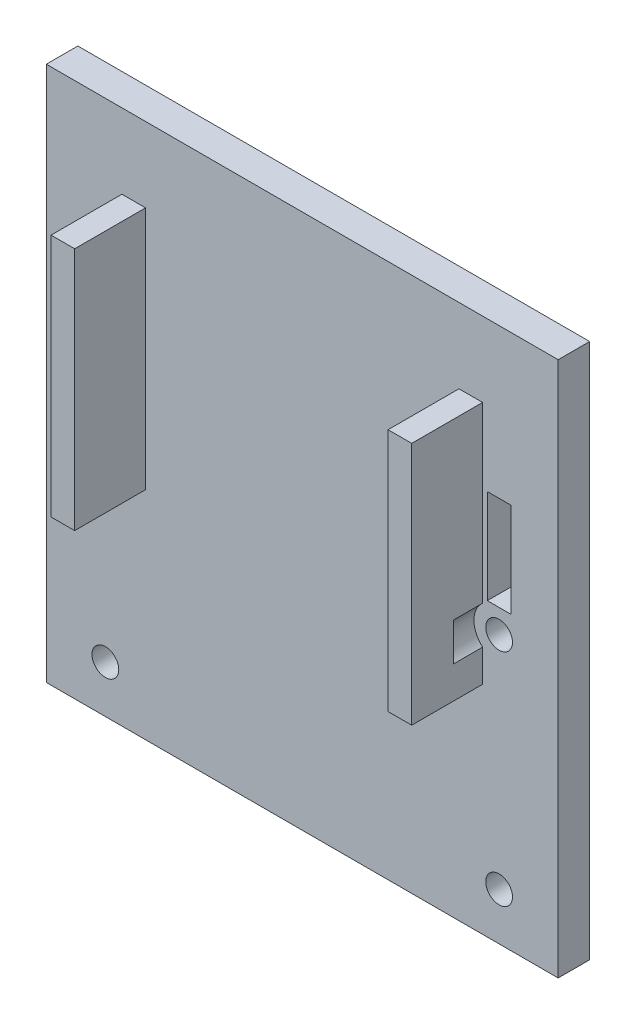
ISO-10303-21;
HEADER;
FILE_DESCRIPTION(('STEP AP214'),'2;1');
FILE_NAME('part.step','',(''),(''),'','','');
FILE_SCHEMA(('AUTOMOTIVE_DESIGN { 1 0 10303 214 1 1 1 1 }'));
ENDSEC;
DATA;
#1=APPLICATION_CONTEXT('core data for automotive mechanical design processes');
#2=APPLICATION_PROTOCOL_DEFINITION('international standard','automotive_design',2000,#1);
#3=PRODUCT_CONTEXT('',#1,'mechanical');
#4=PRODUCT('Part','Part','',(#3));
#5=PRODUCT_RELATED_PRODUCT_CATEGORY('part','',(#4));
#6=PRODUCT_DEFINITION_FORMATION('','',#4);
#7=PRODUCT_DEFINITION_CONTEXT('part definition',#1,'design');
#8=PRODUCT_DEFINITION('design','',#6,#7);
#9=PRODUCT_DEFINITION_SHAPE('','',#8);
#10=(LENGTH_UNIT() NAMED_UNIT(*) SI_UNIT(.MILLI.,.METRE.));
#11=(NAMED_UNIT(*) PLANE_ANGLE_UNIT() SI_UNIT($,.RADIAN.));
#12=(NAMED_UNIT(*) SI_UNIT($,.STERADIAN.) SOLID_ANGLE_UNIT());
#13=UNCERTAINTY_MEASURE_WITH_UNIT(LENGTH_MEASURE(1.E-05),#10,'distance_accuracy_value','');
#14=(GEOMETRIC_REPRESENTATION_CONTEXT(3) GLOBAL_UNCERTAINTY_ASSIGNED_CONTEXT((#13)) GLOBAL_UNIT_ASSIGNED_CONTEXT((#10,
#11,#12)) REPRESENTATION_CONTEXT('',''));
#15=CARTESIAN_POINT('',(0.,0.,0.));
#16=DIRECTION('',(0.,0.,1.));
#17=DIRECTION('',(1.,0.,0.));
#18=AXIS2_PLACEMENT_3D('',#15,#16,#17);
#19=CARTESIAN_POINT('',(0.,0.,4.));
#20=DIRECTION('',(0.,0.,1.));
#21=DIRECTION('',(1.,0.,0.));
#22=AXIS2_PLACEMENT_3D('',#19,#20,#21);
#23=PLANE('',#22);
#24=CARTESIAN_POINT('',(25.,-37.,4.));
#25=DIRECTION('',(0.,0.,1.));
#26=DIRECTION('',(1.,0.,0.));
#27=AXIS2_PLACEMENT_3D('',#24,#25,#26);
#28=CIRCLE('',#27,1.7);
#29=CARTESIAN_POINT('',(26.7,-37.,4.));
#30=VERTEX_POINT('',#29);
#31=EDGE_CURVE('E261',#30,#30,#28,.F.);
#32=ORIENTED_EDGE('',*,*,#31,.T.);
#33=EDGE_LOOP('',(#32));
#34=FACE_BOUND('',#33,.T.);
#35=CARTESIAN_POINT('',(-25.,-37.,4.));
#36=DIRECTION('',(0.,0.,1.));
#37=DIRECTION('',(1.,0.,0.));
#38=AXIS2_PLACEMENT_3D('',#35,#36,#37);
#39=CIRCLE('',#38,1.7);
#40=CARTESIAN_POINT('',(-23.3,-37.,4.));
#41=VERTEX_POINT('',#40);
#42=EDGE_CURVE('E253',#41,#41,#39,.F.);
#43=ORIENTED_EDGE('',*,*,#42,.T.);
#44=EDGE_LOOP('',(#43));
#45=FACE_BOUND('',#44,.T.);
#46=DIRECTION('',(1.,0.,0.));
#47=VECTOR('',#46,1.);
#48=CARTESIAN_POINT('',(-32.5,-43.,4.));
#49=LINE('',#48,#47);
#50=CARTESIAN_POINT('',(-32.5,-43.,4.));
#51=VERTEX_POINT('',#50);
#52=CARTESIAN_POINT('',(32.5,-43.,4.));
#53=VERTEX_POINT('',#52);
#54=EDGE_CURVE('E331',#51,#53,#49,.T.);
#55=ORIENTED_EDGE('',*,*,#54,.T.);
#56=DIRECTION('',(0.,1.,0.));
#57=VECTOR('',#56,1.);
#58=CARTESIAN_POINT('',(32.5,-43.,4.));
#59=LINE('',#58,#57);
#60=CARTESIAN_POINT('',(32.5,25.,4.));
#61=VERTEX_POINT('',#60);
#62=EDGE_CURVE('E334',#53,#61,#59,.T.);
#63=ORIENTED_EDGE('',*,*,#62,.T.);
#64=DIRECTION('',(-1.,0.,0.));
#65=VECTOR('',#64,1.);
#66=CARTESIAN_POINT('',(32.5,25.,4.));
#67=LINE('',#66,#65);
#68=CARTESIAN_POINT('',(-32.5,25.,4.));
#69=VERTEX_POINT('',#68);
#70=EDGE_CURVE('E337',#61,#69,#67,.T.);
#71=ORIENTED_EDGE('',*,*,#70,.T.);
#72=DIRECTION('',(0.,-1.,0.));
#73=VECTOR('',#72,1.);
#74=CARTESIAN_POINT('',(-32.5,25.,4.));
#75=LINE('',#74,#73);
#76=EDGE_CURVE('E339',#69,#51,#75,.T.);
#77=ORIENTED_EDGE('',*,*,#76,.T.);
#78=EDGE_LOOP('',(#55,#63,#71,#77));
#79=FACE_BOUND('',#78,.T.);
#80=DIRECTION('',(0.,-1.,0.));
#81=VECTOR('',#80,1.);
#82=CARTESIAN_POINT('',(-22.9,-15.5,4.));
#83=LINE('',#82,#81);
#84=CARTESIAN_POINT('',(-22.9,-11.4145392935299,4.));
#85=VERTEX_POINT('',#84);
#86=CARTESIAN_POINT('',(-22.9,-15.5,4.));
#87=VERTEX_POINT('',#86);
#88=EDGE_CURVE('E318',#85,#87,#83,.T.);
#89=ORIENTED_EDGE('',*,*,#88,.F.);
#90=CARTESIAN_POINT('',(-25.,-9.,4.));
#91=DIRECTION('',(0.,0.,1.));
#92=DIRECTION('',(1.,0.,0.));
#93=AXIS2_PLACEMENT_3D('',#90,#91,#92);
#94=CIRCLE('',#93,3.2);
#95=CARTESIAN_POINT('',(-22.9,-6.58546070647007,4.));
#96=VERTEX_POINT('',#95);
#97=EDGE_CURVE('E247',#85,#96,#94,.T.);
#98=ORIENTED_EDGE('',*,*,#97,.T.);
#99=CARTESIAN_POINT('',(-22.9,15.5,4.));
#100=VERTEX_POINT('',#99);
#101=EDGE_CURVE('E304',#100,#96,#83,.T.);
#102=ORIENTED_EDGE('',*,*,#101,.F.);
#103=DIRECTION('',(-1.,0.,0.));
#104=VECTOR('',#103,1.);
#105=CARTESIAN_POINT('',(-22.9,15.5,4.));
#106=LINE('',#105,#104);
#107=CARTESIAN_POINT('',(-19.9,15.5,4.));
#108=VERTEX_POINT('',#107);
#109=EDGE_CURVE('E315',#108,#100,#106,.T.);
#110=ORIENTED_EDGE('',*,*,#109,.F.);
#111=DIRECTION('',(0.,1.,0.));
#112=VECTOR('',#111,1.);
#113=CARTESIAN_POINT('',(-19.9,15.5,4.));
#114=LINE('',#113,#112);
#115=CARTESIAN_POINT('',(-19.9,-15.5,4.));
#116=VERTEX_POINT('',#115);
#117=EDGE_CURVE('E313',#116,#108,#114,.T.);
#118=ORIENTED_EDGE('',*,*,#117,.F.);
#119=DIRECTION('',(1.,0.,0.));
#120=VECTOR('',#119,1.);
#121=CARTESIAN_POINT('',(-19.9,-15.5,4.));
#122=LINE('',#121,#120);
#123=EDGE_CURVE('E292',#87,#116,#122,.T.);
#124=ORIENTED_EDGE('',*,*,#123,.F.);
#125=EDGE_LOOP('',(#89,#98,#102,#110,#118,#124));
#126=FACE_BOUND('',#125,.T.);
#127=DIRECTION('',(0.,1.,0.));
#128=VECTOR('',#127,1.);
#129=CARTESIAN_POINT('',(22.9,15.5,4.));
#130=LINE('',#129,#128);
#131=CARTESIAN_POINT('',(22.9,-6.58546070647007,4.));
#132=VERTEX_POINT('',#131);
#133=CARTESIAN_POINT('',(22.9,15.5,4.));
#134=VERTEX_POINT('',#133);
#135=EDGE_CURVE('E285',#132,#134,#130,.T.);
#136=ORIENTED_EDGE('',*,*,#135,.F.);
#137=CARTESIAN_POINT('',(25.,-9.,4.));
#138=DIRECTION('',(0.,0.,1.));
#139=DIRECTION('',(1.,0.,0.));
#140=AXIS2_PLACEMENT_3D('',#137,#138,#139);
#141=CIRCLE('',#140,3.2);
#142=CARTESIAN_POINT('',(22.9,-11.4145392935299,4.));
#143=VERTEX_POINT('',#142);
#144=EDGE_CURVE('E249',#132,#143,#141,.T.);
#145=ORIENTED_EDGE('',*,*,#144,.T.);
#146=CARTESIAN_POINT('',(22.9,-15.5,4.));
#147=VERTEX_POINT('',#146);
#148=EDGE_CURVE('E286',#147,#143,#130,.T.);
#149=ORIENTED_EDGE('',*,*,#148,.F.);
#150=DIRECTION('',(1.,0.,0.));
#151=VECTOR('',#150,1.);
#152=CARTESIAN_POINT('',(22.9,-15.5,4.));
#153=LINE('',#152,#151);
#154=CARTESIAN_POINT('',(19.9,-15.5,4.));
#155=VERTEX_POINT('',#154);
#156=EDGE_CURVE('E289',#155,#147,#153,.T.);
#157=ORIENTED_EDGE('',*,*,#156,.F.);
#158=DIRECTION('',(0.,-1.,0.));
#159=VECTOR('',#158,1.);
#160=CARTESIAN_POINT('',(19.9,-15.5,4.));
#161=LINE('',#160,#159);
#162=CARTESIAN_POINT('',(19.9,15.5,4.));
#163=VERTEX_POINT('',#162);
#164=EDGE_CURVE('E279',#163,#155,#161,.T.);
#165=ORIENTED_EDGE('',*,*,#164,.F.);
#166=DIRECTION('',(-1.,0.,0.));
#167=VECTOR('',#166,1.);
#168=CARTESIAN_POINT('',(19.9,15.5,4.));
#169=LINE('',#168,#167);
#170=EDGE_CURVE('E281',#134,#163,#169,.T.);
#171=ORIENTED_EDGE('',*,*,#170,.F.);
#172=EDGE_LOOP('',(#136,#145,#149,#157,#165,#171));
#173=FACE_BOUND('',#172,.T.);
#174=CARTESIAN_POINT('',(25.,-9.,4.));
#175=DIRECTION('',(0.,0.,1.));
#176=DIRECTION('',(1.,0.,0.));
#177=AXIS2_PLACEMENT_3D('',#174,#175,#176);
#178=CIRCLE('',#177,1.7);
#179=CARTESIAN_POINT('',(26.7,-9.,4.));
#180=VERTEX_POINT('',#179);
#181=EDGE_CURVE('E257',#180,#180,#178,.F.);
#182=ORIENTED_EDGE('',*,*,#181,.T.);
#183=EDGE_LOOP('',(#182));
#184=FACE_BOUND('',#183,.T.);
#185=CARTESIAN_POINT('',(-25.,-9.,4.));
#186=DIRECTION('',(0.,0.,1.));
#187=DIRECTION('',(1.,0.,0.));
#188=AXIS2_PLACEMENT_3D('',#185,#186,#187);
#189=CIRCLE('',#188,1.7);
#190=CARTESIAN_POINT('',(-23.3,-9.,4.));
#191=VERTEX_POINT('',#190);
#192=EDGE_CURVE('E265',#191,#191,#189,.F.);
#193=ORIENTED_EDGE('',*,*,#192,.T.);
#194=EDGE_LOOP('',(#193));
#195=FACE_BOUND('',#194,.T.);
#196=DIRECTION('',(0.,-1.,0.));
#197=VECTOR('',#196,1.);
#198=CARTESIAN_POINT('',(26.5,0.,4.));
#199=LINE('',#198,#197);
#200=CARTESIAN_POINT('',(26.5,6.,4.));
#201=VERTEX_POINT('',#200);
#202=CARTESIAN_POINT('',(26.5,-6.,4.));
#203=VERTEX_POINT('',#202);
#204=EDGE_CURVE('E225',#201,#203,#199,.T.);
#205=ORIENTED_EDGE('',*,*,#204,.T.);
#206=DIRECTION('',(-1.,0.,0.));
#207=VECTOR('',#206,1.);
#208=CARTESIAN_POINT('',(0.,-6.,4.));
#209=LINE('',#208,#207);
#210=CARTESIAN_POINT('',(23.5,-6.,4.));
#211=VERTEX_POINT('',#210);
#212=EDGE_CURVE('E216',#203,#211,#209,.T.);
#213=ORIENTED_EDGE('',*,*,#212,.T.);
#214=DIRECTION('',(0.,1.,0.));
#215=VECTOR('',#214,1.);
#216=CARTESIAN_POINT('',(23.5,0.,4.));
#217=LINE('',#216,#215);
#218=CARTESIAN_POINT('',(23.5,6.,4.));
#219=VERTEX_POINT('',#218);
#220=EDGE_CURVE('E202',#211,#219,#217,.T.);
#221=ORIENTED_EDGE('',*,*,#220,.T.);
#222=DIRECTION('',(1.,0.,0.));
#223=VECTOR('',#222,1.);
#224=CARTESIAN_POINT('',(0.,6.,4.));
#225=LINE('',#224,#223);
#226=EDGE_CURVE('E210',#219,#201,#225,.T.);
#227=ORIENTED_EDGE('',*,*,#226,.T.);
#228=EDGE_LOOP('',(#205,#213,#221,#227));
#229=FACE_BOUND('',#228,.T.);
#230=DIRECTION('',(0.,-1.,0.));
#231=VECTOR('',#230,1.);
#232=CARTESIAN_POINT('',(-23.5,0.,4.));
#233=LINE('',#232,#231);
#234=CARTESIAN_POINT('',(-23.5,6.,4.));
#235=VERTEX_POINT('',#234);
#236=CARTESIAN_POINT('',(-23.5,-6.,4.));
#237=VERTEX_POINT('',#236);
#238=EDGE_CURVE('E236',#235,#237,#233,.T.);
#239=ORIENTED_EDGE('',*,*,#238,.T.);
#240=DIRECTION('',(-1.,0.,0.));
#241=VECTOR('',#240,1.);
#242=CARTESIAN_POINT('',(0.,-6.,4.));
#243=LINE('',#242,#241);
#244=CARTESIAN_POINT('',(-26.5,-6.,4.));
#245=VERTEX_POINT('',#244);
#246=EDGE_CURVE('E239',#237,#245,#243,.T.);
#247=ORIENTED_EDGE('',*,*,#246,.T.);
#248=DIRECTION('',(0.,1.,0.));
#249=VECTOR('',#248,1.);
#250=CARTESIAN_POINT('',(-26.5,0.,4.));
#251=LINE('',#250,#249);
#252=CARTESIAN_POINT('',(-26.5,6.,4.));
#253=VERTEX_POINT('',#252);
#254=EDGE_CURVE('E226',#245,#253,#251,.T.);
#255=ORIENTED_EDGE('',*,*,#254,.T.);
#256=DIRECTION('',(1.,0.,0.));
#257=VECTOR('',#256,1.);
#258=CARTESIAN_POINT('',(0.,6.,4.));
#259=LINE('',#258,#257);
#260=EDGE_CURVE('E229',#253,#235,#259,.T.);
#261=ORIENTED_EDGE('',*,*,#260,.T.);
#262=EDGE_LOOP('',(#239,#247,#255,#261));
#263=FACE_BOUND('',#262,.T.);
#264=ADVANCED_FACE('F43',(#34,#45,#79,#126,#173,#184,#195,#229,#263),#23,.T.);
#265=CARTESIAN_POINT('',(0.,0.,0.));
#266=DIRECTION('',(0.,0.,1.));
#267=DIRECTION('',(1.,0.,0.));
#268=AXIS2_PLACEMENT_3D('',#265,#266,#267);
#269=PLANE('',#268);
#270=DIRECTION('',(-1.,0.,0.));
#271=VECTOR('',#270,1.);
#272=CARTESIAN_POINT('',(0.,-6.,0.));
#273=LINE('',#272,#271);
#274=CARTESIAN_POINT('',(26.5,-6.,0.));
#275=VERTEX_POINT('',#274);
#276=CARTESIAN_POINT('',(23.5,-6.,0.));
#277=VERTEX_POINT('',#276);
#278=EDGE_CURVE('E219',#275,#277,#273,.T.);
#279=ORIENTED_EDGE('',*,*,#278,.F.);
#280=DIRECTION('',(0.,-1.,0.));
#281=VECTOR('',#280,1.);
#282=CARTESIAN_POINT('',(26.5,0.,0.));
#283=LINE('',#282,#281);
#284=CARTESIAN_POINT('',(26.5,6.,0.));
#285=VERTEX_POINT('',#284);
#286=EDGE_CURVE('E388',#285,#275,#283,.T.);
#287=ORIENTED_EDGE('',*,*,#286,.F.);
#288=DIRECTION('',(1.,0.,0.));
#289=VECTOR('',#288,1.);
#290=CARTESIAN_POINT('',(0.,6.,0.));
#291=LINE('',#290,#289);
#292=CARTESIAN_POINT('',(23.5,6.,0.));
#293=VERTEX_POINT('',#292);
#294=EDGE_CURVE('E386',#293,#285,#291,.T.);
#295=ORIENTED_EDGE('',*,*,#294,.F.);
#296=DIRECTION('',(0.,1.,0.));
#297=VECTOR('',#296,1.);
#298=CARTESIAN_POINT('',(23.5,0.,0.));
#299=LINE('',#298,#297);
#300=EDGE_CURVE('E384',#277,#293,#299,.T.);
#301=ORIENTED_EDGE('',*,*,#300,.F.);
#302=EDGE_LOOP('',(#279,#287,#295,#301));
#303=FACE_BOUND('',#302,.T.);
#304=CARTESIAN_POINT('',(-25.,-9.,0.));
#305=DIRECTION('',(0.,0.,1.));
#306=DIRECTION('',(1.,0.,0.));
#307=AXIS2_PLACEMENT_3D('',#304,#305,#306);
#308=CIRCLE('',#307,1.7);
#309=CARTESIAN_POINT('',(-23.3,-9.,0.));
#310=VERTEX_POINT('',#309);
#311=EDGE_CURVE('E264',#310,#310,#308,.F.);
#312=ORIENTED_EDGE('',*,*,#311,.F.);
#313=EDGE_LOOP('',(#312));
#314=FACE_BOUND('',#313,.T.);
#315=CARTESIAN_POINT('',(25.,-37.,0.));
#316=DIRECTION('',(0.,0.,1.));
#317=DIRECTION('',(1.,0.,0.));
#318=AXIS2_PLACEMENT_3D('',#315,#316,#317);
#319=CIRCLE('',#318,1.7);
#320=CARTESIAN_POINT('',(26.7,-37.,0.));
#321=VERTEX_POINT('',#320);
#322=EDGE_CURVE('E260',#321,#321,#319,.F.);
#323=ORIENTED_EDGE('',*,*,#322,.F.);
#324=EDGE_LOOP('',(#323));
#325=FACE_BOUND('',#324,.T.);
#326=CARTESIAN_POINT('',(25.,-9.,0.));
#327=DIRECTION('',(0.,0.,1.));
#328=DIRECTION('',(1.,0.,0.));
#329=AXIS2_PLACEMENT_3D('',#326,#327,#328);
#330=CIRCLE('',#329,1.7);
#331=CARTESIAN_POINT('',(26.7,-9.,0.));
#332=VERTEX_POINT('',#331);
#333=EDGE_CURVE('E256',#332,#332,#330,.F.);
#334=ORIENTED_EDGE('',*,*,#333,.F.);
#335=EDGE_LOOP('',(#334));
#336=FACE_BOUND('',#335,.T.);
#337=CARTESIAN_POINT('',(-25.,-37.,0.));
#338=DIRECTION('',(0.,0.,1.));
#339=DIRECTION('',(1.,0.,0.));
#340=AXIS2_PLACEMENT_3D('',#337,#338,#339);
#341=CIRCLE('',#340,1.7);
#342=CARTESIAN_POINT('',(-23.3,-37.,0.));
#343=VERTEX_POINT('',#342);
#344=EDGE_CURVE('E246',#343,#343,#341,.F.);
#345=ORIENTED_EDGE('',*,*,#344,.F.);
#346=EDGE_LOOP('',(#345));
#347=FACE_BOUND('',#346,.T.);
#348=DIRECTION('',(1.,0.,0.));
#349=VECTOR('',#348,1.);
#350=CARTESIAN_POINT('',(-32.5,-43.,0.));
#351=LINE('',#350,#349);
#352=CARTESIAN_POINT('',(-32.5,-43.,0.));
#353=VERTEX_POINT('',#352);
#354=CARTESIAN_POINT('',(32.5,-43.,0.));
#355=VERTEX_POINT('',#354);
#356=EDGE_CURVE('E330',#353,#355,#351,.T.);
#357=ORIENTED_EDGE('',*,*,#356,.F.);
#358=DIRECTION('',(0.,-1.,0.));
#359=VECTOR('',#358,1.);
#360=CARTESIAN_POINT('',(-32.5,25.,0.));
#361=LINE('',#360,#359);
#362=CARTESIAN_POINT('',(-32.5,25.,0.));
#363=VERTEX_POINT('',#362);
#364=EDGE_CURVE('E335',#363,#353,#361,.T.);
#365=ORIENTED_EDGE('',*,*,#364,.F.);
#366=DIRECTION('',(-1.,0.,0.));
#367=VECTOR('',#366,1.);
#368=CARTESIAN_POINT('',(32.5,25.,0.));
#369=LINE('',#368,#367);
#370=CARTESIAN_POINT('',(32.5,25.,0.));
#371=VERTEX_POINT('',#370);
#372=EDGE_CURVE('E346',#371,#363,#369,.T.);
#373=ORIENTED_EDGE('',*,*,#372,.F.);
#374=DIRECTION('',(0.,1.,0.));
#375=VECTOR('',#374,1.);
#376=CARTESIAN_POINT('',(32.5,-43.,0.));
#377=LINE('',#376,#375);
#378=EDGE_CURVE('E344',#355,#371,#377,.T.);
#379=ORIENTED_EDGE('',*,*,#378,.F.);
#380=EDGE_LOOP('',(#357,#365,#373,#379));
#381=FACE_BOUND('',#380,.T.);
#382=DIRECTION('',(-1.,0.,0.));
#383=VECTOR('',#382,1.);
#384=CARTESIAN_POINT('',(0.,-6.,0.));
#385=LINE('',#384,#383);
#386=CARTESIAN_POINT('',(-23.5,-6.,0.));
#387=VERTEX_POINT('',#386);
#388=CARTESIAN_POINT('',(-26.5,-6.,0.));
#389=VERTEX_POINT('',#388);
#390=EDGE_CURVE('E11',#387,#389,#385,.T.);
#391=ORIENTED_EDGE('',*,*,#390,.F.);
#392=DIRECTION('',(0.,-1.,0.));
#393=VECTOR('',#392,1.);
#394=CARTESIAN_POINT('',(-23.5,0.,0.));
#395=LINE('',#394,#393);
#396=CARTESIAN_POINT('',(-23.5,6.,0.));
#397=VERTEX_POINT('',#396);
#398=EDGE_CURVE('E51',#397,#387,#395,.T.);
#399=ORIENTED_EDGE('',*,*,#398,.F.);
#400=DIRECTION('',(1.,0.,0.));
#401=VECTOR('',#400,1.);
#402=CARTESIAN_POINT('',(0.,6.,0.));
#403=LINE('',#402,#401);
#404=CARTESIAN_POINT('',(-26.5,6.,0.));
#405=VERTEX_POINT('',#404);
#406=EDGE_CURVE('E393',#405,#397,#403,.T.);
#407=ORIENTED_EDGE('',*,*,#406,.F.);
#408=DIRECTION('',(0.,1.,0.));
#409=VECTOR('',#408,1.);
#410=CARTESIAN_POINT('',(-26.5,0.,0.));
#411=LINE('',#410,#409);
#412=EDGE_CURVE('E391',#389,#405,#411,.T.);
#413=ORIENTED_EDGE('',*,*,#412,.F.);
#414=EDGE_LOOP('',(#391,#399,#407,#413));
#415=FACE_BOUND('',#414,.T.);
#416=ADVANCED_FACE('F410',(#303,#314,#325,#336,#347,#381,#415),#269,.F.);
#417=CARTESIAN_POINT('',(-22.9,-15.5,13.));
#418=DIRECTION('',(1.,0.,0.));
#419=DIRECTION('',(0.,0.,-1.));
#420=AXIS2_PLACEMENT_3D('',#417,#418,#419);
#421=PLANE('',#420);
#422=DIRECTION('',(0.,0.,-1.));
#423=VECTOR('',#422,1.);
#424=CARTESIAN_POINT('',(-22.9,-11.4145392935299,7.7));
#425=LINE('',#424,#423);
#426=CARTESIAN_POINT('',(-22.9,-11.4145392935299,7.7));
#427=VERTEX_POINT('',#426);
#428=EDGE_CURVE('E382',#85,#427,#425,.F.);
#429=ORIENTED_EDGE('',*,*,#428,.F.);
#430=ORIENTED_EDGE('',*,*,#88,.T.);
#431=DIRECTION('',(0.,0.,-1.));
#432=VECTOR('',#431,1.);
#433=CARTESIAN_POINT('',(-22.9,-15.5,13.));
#434=LINE('',#433,#432);
#435=CARTESIAN_POINT('',(-22.9,-15.5,13.));
#436=VERTEX_POINT('',#435);
#437=EDGE_CURVE('E310',#436,#87,#434,.T.);
#438=ORIENTED_EDGE('',*,*,#437,.F.);
#439=DIRECTION('',(0.,-1.,0.));
#440=VECTOR('',#439,1.);
#441=CARTESIAN_POINT('',(-22.9,-15.5,13.));
#442=LINE('',#441,#440);
#443=CARTESIAN_POINT('',(-22.9,15.5,13.));
#444=VERTEX_POINT('',#443);
#445=EDGE_CURVE('E308',#444,#436,#442,.T.);
#446=ORIENTED_EDGE('',*,*,#445,.F.);
#447=DIRECTION('',(0.,0.,-1.));
#448=VECTOR('',#447,1.);
#449=CARTESIAN_POINT('',(-22.9,15.5,13.));
#450=LINE('',#449,#448);
#451=EDGE_CURVE('E323',#444,#100,#450,.T.);
#452=ORIENTED_EDGE('',*,*,#451,.T.);
#453=ORIENTED_EDGE('',*,*,#101,.T.);
#454=DIRECTION('',(0.,0.,-1.));
#455=VECTOR('',#454,1.);
#456=CARTESIAN_POINT('',(-22.9,-6.58546070647007,7.7));
#457=LINE('',#456,#455);
#458=CARTESIAN_POINT('',(-22.9,-6.58546070647007,7.7));
#459=VERTEX_POINT('',#458);
#460=EDGE_CURVE('E379',#459,#96,#457,.T.);
#461=ORIENTED_EDGE('',*,*,#460,.F.);
#462=DIRECTION('',(0.,-1.,0.));
#463=VECTOR('',#462,1.);
#464=CARTESIAN_POINT('',(-22.9,-15.5,7.7));
#465=LINE('',#464,#463);
#466=EDGE_CURVE('E376',#459,#427,#465,.T.);
#467=ORIENTED_EDGE('',*,*,#466,.T.);
#468=EDGE_LOOP('',(#429,#430,#438,#446,#452,#453,#461,#467));
#469=FACE_BOUND('',#468,.T.);
#470=ADVANCED_FACE('F433',(#469),#421,.F.);
#471=CARTESIAN_POINT('',(22.9,15.5,13.));
#472=DIRECTION('',(-1.,0.,0.));
#473=DIRECTION('',(0.,0.,1.));
#474=AXIS2_PLACEMENT_3D('',#471,#472,#473);
#475=PLANE('',#474);
#476=DIRECTION('',(0.,0.,-1.));
#477=VECTOR('',#476,1.);
#478=CARTESIAN_POINT('',(22.9,-6.58546070647007,7.7));
#479=LINE('',#478,#477);
#480=CARTESIAN_POINT('',(22.9,-6.58546070647007,7.7));
#481=VERTEX_POINT('',#480);
#482=EDGE_CURVE('E374',#132,#481,#479,.F.);
#483=ORIENTED_EDGE('',*,*,#482,.F.);
#484=ORIENTED_EDGE('',*,*,#135,.T.);
#485=DIRECTION('',(0.,0.,-1.));
#486=VECTOR('',#485,1.);
#487=CARTESIAN_POINT('',(22.9,15.5,13.));
#488=LINE('',#487,#486);
#489=CARTESIAN_POINT('',(22.9,15.5,13.));
#490=VERTEX_POINT('',#489);
#491=EDGE_CURVE('E270',#490,#134,#488,.T.);
#492=ORIENTED_EDGE('',*,*,#491,.F.);
#493=DIRECTION('',(0.,1.,0.));
#494=VECTOR('',#493,1.);
#495=CARTESIAN_POINT('',(22.9,15.5,13.));
#496=LINE('',#495,#494);
#497=CARTESIAN_POINT('',(22.9,-15.5,13.));
#498=VERTEX_POINT('',#497);
#499=EDGE_CURVE('E296',#498,#490,#496,.T.);
#500=ORIENTED_EDGE('',*,*,#499,.F.);
#501=DIRECTION('',(0.,0.,-1.));
#502=VECTOR('',#501,1.);
#503=CARTESIAN_POINT('',(22.9,-15.5,13.));
#504=LINE('',#503,#502);
#505=EDGE_CURVE('E268',#498,#147,#504,.T.);
#506=ORIENTED_EDGE('',*,*,#505,.T.);
#507=ORIENTED_EDGE('',*,*,#148,.T.);
#508=DIRECTION('',(0.,0.,-1.));
#509=VECTOR('',#508,1.);
#510=CARTESIAN_POINT('',(22.9,-11.4145392935299,7.7));
#511=LINE('',#510,#509);
#512=CARTESIAN_POINT('',(22.9,-11.4145392935299,7.7));
#513=VERTEX_POINT('',#512);
#514=EDGE_CURVE('E371',#513,#143,#511,.T.);
#515=ORIENTED_EDGE('',*,*,#514,.F.);
#516=DIRECTION('',(0.,1.,0.));
#517=VECTOR('',#516,1.);
#518=CARTESIAN_POINT('',(22.9,15.5,7.7));
#519=LINE('',#518,#517);
#520=EDGE_CURVE('E360',#513,#481,#519,.T.);
#521=ORIENTED_EDGE('',*,*,#520,.T.);
#522=EDGE_LOOP('',(#483,#484,#492,#500,#506,#507,#515,#521));
#523=FACE_BOUND('',#522,.T.);
#524=ADVANCED_FACE('F506',(#523),#475,.F.);
#525=CARTESIAN_POINT('',(-32.5,-43.,4.));
#526=DIRECTION('',(0.,1.,0.));
#527=DIRECTION('',(0.,0.,1.));
#528=AXIS2_PLACEMENT_3D('',#525,#526,#527);
#529=PLANE('',#528);
#530=ORIENTED_EDGE('',*,*,#356,.T.);
#531=DIRECTION('',(0.,0.,-1.));
#532=VECTOR('',#531,1.);
#533=CARTESIAN_POINT('',(32.5,-43.,4.));
#534=LINE('',#533,#532);
#535=EDGE_CURVE('E357',#53,#355,#534,.T.);
#536=ORIENTED_EDGE('',*,*,#535,.F.);
#537=ORIENTED_EDGE('',*,*,#54,.F.);
#538=DIRECTION('',(0.,0.,-1.));
#539=VECTOR('',#538,1.);
#540=CARTESIAN_POINT('',(-32.5,-43.,4.));
#541=LINE('',#540,#539);
#542=EDGE_CURVE('E341',#51,#353,#541,.T.);
#543=ORIENTED_EDGE('',*,*,#542,.T.);
#544=EDGE_LOOP('',(#530,#536,#537,#543));
#545=FACE_BOUND('',#544,.T.);
#546=ADVANCED_FACE('F45',(#545),#529,.F.);
#547=CARTESIAN_POINT('',(32.5,-43.,4.));
#548=DIRECTION('',(-1.,0.,0.));
#549=DIRECTION('',(0.,0.,1.));
#550=AXIS2_PLACEMENT_3D('',#547,#548,#549);
#551=PLANE('',#550);
#552=ORIENTED_EDGE('',*,*,#378,.T.);
#553=DIRECTION('',(0.,0.,-1.));
#554=VECTOR('',#553,1.);
#555=CARTESIAN_POINT('',(32.5,25.,4.));
#556=LINE('',#555,#554);
#557=EDGE_CURVE('E354',#61,#371,#556,.T.);
#558=ORIENTED_EDGE('',*,*,#557,.F.);
#559=ORIENTED_EDGE('',*,*,#62,.F.);
#560=ORIENTED_EDGE('',*,*,#535,.T.);
#561=EDGE_LOOP('',(#552,#558,#559,#560));
#562=FACE_BOUND('',#561,.T.);
#563=ADVANCED_FACE('F459',(#562),#551,.F.);
#564=CARTESIAN_POINT('',(32.5,25.,4.));
#565=DIRECTION('',(0.,-1.,0.));
#566=DIRECTION('',(0.,0.,-1.));
#567=AXIS2_PLACEMENT_3D('',#564,#565,#566);
#568=PLANE('',#567);
#569=ORIENTED_EDGE('',*,*,#372,.T.);
#570=DIRECTION('',(0.,0.,-1.));
#571=VECTOR('',#570,1.);
#572=CARTESIAN_POINT('',(-32.5,25.,4.));
#573=LINE('',#572,#571);
#574=EDGE_CURVE('E351',#69,#363,#573,.T.);
#575=ORIENTED_EDGE('',*,*,#574,.F.);
#576=ORIENTED_EDGE('',*,*,#70,.F.);
#577=ORIENTED_EDGE('',*,*,#557,.T.);
#578=EDGE_LOOP('',(#569,#575,#576,#577));
#579=FACE_BOUND('',#578,.T.);
#580=ADVANCED_FACE('F456',(#579),#568,.F.);
#581=CARTESIAN_POINT('',(-32.5,25.,4.));
#582=DIRECTION('',(1.,0.,0.));
#583=DIRECTION('',(0.,0.,-1.));
#584=AXIS2_PLACEMENT_3D('',#581,#582,#583);
#585=PLANE('',#584);
#586=ORIENTED_EDGE('',*,*,#364,.T.);
#587=ORIENTED_EDGE('',*,*,#542,.F.);
#588=ORIENTED_EDGE('',*,*,#76,.F.);
#589=ORIENTED_EDGE('',*,*,#574,.T.);
#590=EDGE_LOOP('',(#586,#587,#588,#589));
#591=FACE_BOUND('',#590,.T.);
#592=ADVANCED_FACE('F452',(#591),#585,.F.);
#593=CARTESIAN_POINT('',(-19.9,-15.5,13.));
#594=DIRECTION('',(0.,1.,0.));
#595=DIRECTION('',(0.,0.,1.));
#596=AXIS2_PLACEMENT_3D('',#593,#594,#595);
#597=PLANE('',#596);
#598=ORIENTED_EDGE('',*,*,#123,.T.);
#599=DIRECTION('',(0.,0.,-1.));
#600=VECTOR('',#599,1.);
#601=CARTESIAN_POINT('',(-19.9,-15.5,13.));
#602=LINE('',#601,#600);
#603=CARTESIAN_POINT('',(-19.9,-15.5,13.));
#604=VERTEX_POINT('',#603);
#605=EDGE_CURVE('E328',#604,#116,#602,.T.);
#606=ORIENTED_EDGE('',*,*,#605,.F.);
#607=DIRECTION('',(1.,0.,0.));
#608=VECTOR('',#607,1.);
#609=CARTESIAN_POINT('',(-19.9,-15.5,13.));
#610=LINE('',#609,#608);
#611=EDGE_CURVE('E300',#436,#604,#610,.T.);
#612=ORIENTED_EDGE('',*,*,#611,.F.);
#613=ORIENTED_EDGE('',*,*,#437,.T.);
#614=EDGE_LOOP('',(#598,#606,#612,#613));
#615=FACE_BOUND('',#614,.T.);
#616=ADVANCED_FACE('F532',(#615),#597,.F.);
#617=CARTESIAN_POINT('',(-19.9,15.5,13.));
#618=DIRECTION('',(-1.,0.,0.));
#619=DIRECTION('',(0.,0.,1.));
#620=AXIS2_PLACEMENT_3D('',#617,#618,#619);
#621=PLANE('',#620);
#622=ORIENTED_EDGE('',*,*,#117,.T.);
#623=DIRECTION('',(0.,0.,-1.));
#624=VECTOR('',#623,1.);
#625=CARTESIAN_POINT('',(-19.9,15.5,13.));
#626=LINE('',#625,#624);
#627=CARTESIAN_POINT('',(-19.9,15.5,13.));
#628=VERTEX_POINT('',#627);
#629=EDGE_CURVE('E325',#628,#108,#626,.T.);
#630=ORIENTED_EDGE('',*,*,#629,.F.);
#631=DIRECTION('',(0.,1.,0.));
#632=VECTOR('',#631,1.);
#633=CARTESIAN_POINT('',(-19.9,15.5,13.));
#634=LINE('',#633,#632);
#635=EDGE_CURVE('E303',#604,#628,#634,.T.);
#636=ORIENTED_EDGE('',*,*,#635,.F.);
#637=ORIENTED_EDGE('',*,*,#605,.T.);
#638=EDGE_LOOP('',(#622,#630,#636,#637));
#639=FACE_BOUND('',#638,.T.);
#640=ADVANCED_FACE('F528',(#639),#621,.F.);
#641=CARTESIAN_POINT('',(-22.9,15.5,13.));
#642=DIRECTION('',(0.,-1.,0.));
#643=DIRECTION('',(0.,0.,-1.));
#644=AXIS2_PLACEMENT_3D('',#641,#642,#643);
#645=PLANE('',#644);
#646=ORIENTED_EDGE('',*,*,#109,.T.);
#647=ORIENTED_EDGE('',*,*,#451,.F.);
#648=DIRECTION('',(-1.,0.,0.));
#649=VECTOR('',#648,1.);
#650=CARTESIAN_POINT('',(-22.9,15.5,13.));
#651=LINE('',#650,#649);
#652=EDGE_CURVE('E306',#628,#444,#651,.T.);
#653=ORIENTED_EDGE('',*,*,#652,.F.);
#654=ORIENTED_EDGE('',*,*,#629,.T.);
#655=EDGE_LOOP('',(#646,#647,#653,#654));
#656=FACE_BOUND('',#655,.T.);
#657=ADVANCED_FACE('F522',(#656),#645,.F.);
#658=CARTESIAN_POINT('',(0.,0.,13.));
#659=DIRECTION('',(0.,0.,-1.));
#660=DIRECTION('',(-1.,0.,0.));
#661=AXIS2_PLACEMENT_3D('',#658,#659,#660);
#662=PLANE('',#661);
#663=ORIENTED_EDGE('',*,*,#611,.T.);
#664=ORIENTED_EDGE('',*,*,#635,.T.);
#665=ORIENTED_EDGE('',*,*,#652,.T.);
#666=ORIENTED_EDGE('',*,*,#445,.T.);
#667=EDGE_LOOP('',(#663,#664,#665,#666));
#668=FACE_BOUND('',#667,.T.);
#669=ADVANCED_FACE('F504',(#668),#662,.F.);
#670=CARTESIAN_POINT('',(22.9,-15.5,13.));
#671=DIRECTION('',(0.,1.,0.));
#672=DIRECTION('',(0.,0.,1.));
#673=AXIS2_PLACEMENT_3D('',#670,#671,#672);
#674=PLANE('',#673);
#675=ORIENTED_EDGE('',*,*,#156,.T.);
#676=ORIENTED_EDGE('',*,*,#505,.F.);
#677=DIRECTION('',(1.,0.,0.));
#678=VECTOR('',#677,1.);
#679=CARTESIAN_POINT('',(22.9,-15.5,13.));
#680=LINE('',#679,#678);
#681=CARTESIAN_POINT('',(19.9,-15.5,13.));
#682=VERTEX_POINT('',#681);
#683=EDGE_CURVE('E282',#682,#498,#680,.T.);
#684=ORIENTED_EDGE('',*,*,#683,.F.);
#685=DIRECTION('',(0.,0.,-1.));
#686=VECTOR('',#685,1.);
#687=CARTESIAN_POINT('',(19.9,-15.5,13.));
#688=LINE('',#687,#686);
#689=EDGE_CURVE('E275',#682,#155,#688,.T.);
#690=ORIENTED_EDGE('',*,*,#689,.T.);
#691=EDGE_LOOP('',(#675,#676,#684,#690));
#692=FACE_BOUND('',#691,.T.);
#693=ADVANCED_FACE('F500',(#692),#674,.F.);
#694=CARTESIAN_POINT('',(19.9,15.5,13.));
#695=DIRECTION('',(0.,-1.,0.));
#696=DIRECTION('',(0.,0.,-1.));
#697=AXIS2_PLACEMENT_3D('',#694,#695,#696);
#698=PLANE('',#697);
#699=ORIENTED_EDGE('',*,*,#170,.T.);
#700=DIRECTION('',(0.,0.,-1.));
#701=VECTOR('',#700,1.);
#702=CARTESIAN_POINT('',(19.9,15.5,13.));
#703=LINE('',#702,#701);
#704=CARTESIAN_POINT('',(19.9,15.5,13.));
#705=VERTEX_POINT('',#704);
#706=EDGE_CURVE('E273',#705,#163,#703,.T.);
#707=ORIENTED_EDGE('',*,*,#706,.F.);
#708=DIRECTION('',(-1.,0.,0.));
#709=VECTOR('',#708,1.);
#710=CARTESIAN_POINT('',(19.9,15.5,13.));
#711=LINE('',#710,#709);
#712=EDGE_CURVE('E294',#490,#705,#711,.T.);
#713=ORIENTED_EDGE('',*,*,#712,.F.);
#714=ORIENTED_EDGE('',*,*,#491,.T.);
#715=EDGE_LOOP('',(#699,#707,#713,#714));
#716=FACE_BOUND('',#715,.T.);
#717=ADVANCED_FACE('F503',(#716),#698,.F.);
#718=CARTESIAN_POINT('',(19.9,-15.5,13.));
#719=DIRECTION('',(1.,0.,0.));
#720=DIRECTION('',(0.,0.,-1.));
#721=AXIS2_PLACEMENT_3D('',#718,#719,#720);
#722=PLANE('',#721);
#723=ORIENTED_EDGE('',*,*,#164,.T.);
#724=ORIENTED_EDGE('',*,*,#689,.F.);
#725=DIRECTION('',(0.,-1.,0.));
#726=VECTOR('',#725,1.);
#727=CARTESIAN_POINT('',(19.9,-15.5,13.));
#728=LINE('',#727,#726);
#729=EDGE_CURVE('E278',#705,#682,#728,.T.);
#730=ORIENTED_EDGE('',*,*,#729,.F.);
#731=ORIENTED_EDGE('',*,*,#706,.T.);
#732=EDGE_LOOP('',(#723,#724,#730,#731));
#733=FACE_BOUND('',#732,.T.);
#734=ADVANCED_FACE('F512',(#733),#722,.F.);
#735=CARTESIAN_POINT('',(0.,0.,13.));
#736=DIRECTION('',(0.,0.,-1.));
#737=DIRECTION('',(-1.,0.,0.));
#738=AXIS2_PLACEMENT_3D('',#735,#736,#737);
#739=PLANE('',#738);
#740=ORIENTED_EDGE('',*,*,#683,.T.);
#741=ORIENTED_EDGE('',*,*,#499,.T.);
#742=ORIENTED_EDGE('',*,*,#712,.T.);
#743=ORIENTED_EDGE('',*,*,#729,.T.);
#744=EDGE_LOOP('',(#740,#741,#742,#743));
#745=FACE_BOUND('',#744,.T.);
#746=ADVANCED_FACE('F498',(#745),#739,.F.);
#747=CARTESIAN_POINT('',(-25.,-37.,6.));
#748=DIRECTION('',(0.,0.,-1.));
#749=DIRECTION('',(-1.,0.,0.));
#750=AXIS2_PLACEMENT_3D('',#747,#748,#749);
#751=CYLINDRICAL_SURFACE('',#750,1.7);
#752=ORIENTED_EDGE('',*,*,#42,.F.);
#753=EDGE_LOOP('',(#752));
#754=FACE_BOUND('',#753,.T.);
#755=ORIENTED_EDGE('',*,*,#344,.T.);
#756=EDGE_LOOP('',(#755));
#757=FACE_BOUND('',#756,.T.);
#758=ADVANCED_FACE('F495',(#754,#757),#751,.F.);
#759=CARTESIAN_POINT('',(25.,-9.,6.));
#760=DIRECTION('',(0.,0.,-1.));
#761=DIRECTION('',(-1.,0.,0.));
#762=AXIS2_PLACEMENT_3D('',#759,#760,#761);
#763=CYLINDRICAL_SURFACE('',#762,1.7);
#764=ORIENTED_EDGE('',*,*,#181,.F.);
#765=EDGE_LOOP('',(#764));
#766=FACE_BOUND('',#765,.T.);
#767=ORIENTED_EDGE('',*,*,#333,.T.);
#768=EDGE_LOOP('',(#767));
#769=FACE_BOUND('',#768,.T.);
#770=ADVANCED_FACE('F489',(#766,#769),#763,.F.);
#771=CARTESIAN_POINT('',(25.,-37.,6.));
#772=DIRECTION('',(0.,0.,-1.));
#773=DIRECTION('',(-1.,0.,0.));
#774=AXIS2_PLACEMENT_3D('',#771,#772,#773);
#775=CYLINDRICAL_SURFACE('',#774,1.7);
#776=ORIENTED_EDGE('',*,*,#31,.F.);
#777=EDGE_LOOP('',(#776));
#778=FACE_BOUND('',#777,.T.);
#779=ORIENTED_EDGE('',*,*,#322,.T.);
#780=EDGE_LOOP('',(#779));
#781=FACE_BOUND('',#780,.T.);
#782=ADVANCED_FACE('F479',(#778,#781),#775,.F.);
#783=CARTESIAN_POINT('',(-25.,-9.,6.));
#784=DIRECTION('',(0.,0.,-1.));
#785=DIRECTION('',(-1.,0.,0.));
#786=AXIS2_PLACEMENT_3D('',#783,#784,#785);
#787=CYLINDRICAL_SURFACE('',#786,1.7);
#788=ORIENTED_EDGE('',*,*,#192,.F.);
#789=EDGE_LOOP('',(#788));
#790=FACE_BOUND('',#789,.T.);
#791=ORIENTED_EDGE('',*,*,#311,.T.);
#792=EDGE_LOOP('',(#791));
#793=FACE_BOUND('',#792,.T.);
#794=ADVANCED_FACE('F475',(#790,#793),#787,.F.);
#795=CARTESIAN_POINT('',(25.,-9.,7.7));
#796=DIRECTION('',(0.,0.,-1.));
#797=DIRECTION('',(-1.,0.,0.));
#798=AXIS2_PLACEMENT_3D('',#795,#796,#797);
#799=CYLINDRICAL_SURFACE('',#798,3.2);
#800=ORIENTED_EDGE('',*,*,#482,.T.);
#801=CARTESIAN_POINT('',(25.,-9.,7.7));
#802=DIRECTION('',(0.,0.,1.));
#803=DIRECTION('',(1.,0.,0.));
#804=AXIS2_PLACEMENT_3D('',#801,#802,#803);
#805=CIRCLE('',#804,3.2);
#806=EDGE_CURVE('E242',#481,#513,#805,.T.);
#807=ORIENTED_EDGE('',*,*,#806,.T.);
#808=ORIENTED_EDGE('',*,*,#514,.T.);
#809=ORIENTED_EDGE('',*,*,#144,.F.);
#810=EDGE_LOOP('',(#800,#807,#808,#809));
#811=FACE_BOUND('',#810,.T.);
#812=ADVANCED_FACE('F478',(#811),#799,.F.);
#813=CARTESIAN_POINT('',(25.,-9.,7.7));
#814=DIRECTION('',(0.,0.,1.));
#815=DIRECTION('',(1.,0.,0.));
#816=AXIS2_PLACEMENT_3D('',#813,#814,#815);
#817=PLANE('',#816);
#818=ORIENTED_EDGE('',*,*,#806,.F.);
#819=ORIENTED_EDGE('',*,*,#520,.F.);
#820=EDGE_LOOP('',(#818,#819));
#821=FACE_BOUND('',#820,.T.);
#822=ADVANCED_FACE('F486',(#821),#817,.F.);
#823=CARTESIAN_POINT('',(-25.,-9.,7.7));
#824=DIRECTION('',(0.,0.,-1.));
#825=DIRECTION('',(-1.,0.,0.));
#826=AXIS2_PLACEMENT_3D('',#823,#824,#825);
#827=CYLINDRICAL_SURFACE('',#826,3.2);
#828=ORIENTED_EDGE('',*,*,#428,.T.);
#829=CARTESIAN_POINT('',(-25.,-9.,7.7));
#830=DIRECTION('',(0.,0.,1.));
#831=DIRECTION('',(1.,0.,0.));
#832=AXIS2_PLACEMENT_3D('',#829,#830,#831);
#833=CIRCLE('',#832,3.2);
#834=EDGE_CURVE('E243',#427,#459,#833,.T.);
#835=ORIENTED_EDGE('',*,*,#834,.T.);
#836=ORIENTED_EDGE('',*,*,#460,.T.);
#837=ORIENTED_EDGE('',*,*,#97,.F.);
#838=EDGE_LOOP('',(#828,#835,#836,#837));
#839=FACE_BOUND('',#838,.T.);
#840=ADVANCED_FACE('F660',(#839),#827,.F.);
#841=CARTESIAN_POINT('',(-25.,-9.,7.7));
#842=DIRECTION('',(0.,0.,1.));
#843=DIRECTION('',(1.,0.,0.));
#844=AXIS2_PLACEMENT_3D('',#841,#842,#843);
#845=PLANE('',#844);
#846=ORIENTED_EDGE('',*,*,#834,.F.);
#847=ORIENTED_EDGE('',*,*,#466,.F.);
#848=EDGE_LOOP('',(#846,#847));
#849=FACE_BOUND('',#848,.T.);
#850=ADVANCED_FACE('F669',(#849),#845,.F.);
#851=CARTESIAN_POINT('',(26.5,-6.,6.));
#852=DIRECTION('',(0.,1.,0.));
#853=DIRECTION('',(0.,0.,1.));
#854=AXIS2_PLACEMENT_3D('',#851,#852,#853);
#855=PLANE('',#854);
#856=DIRECTION('',(0.,0.,-1.));
#857=VECTOR('',#856,1.);
#858=CARTESIAN_POINT('',(26.5,-6.,6.));
#859=LINE('',#858,#857);
#860=EDGE_CURVE('E418',#203,#275,#859,.T.);
#861=ORIENTED_EDGE('',*,*,#860,.T.);
#862=ORIENTED_EDGE('',*,*,#278,.T.);
#863=DIRECTION('',(0.,0.,-1.));
#864=VECTOR('',#863,1.);
#865=CARTESIAN_POINT('',(23.5,-6.,6.));
#866=LINE('',#865,#864);
#867=EDGE_CURVE('E205',#211,#277,#866,.T.);
#868=ORIENTED_EDGE('',*,*,#867,.F.);
#869=ORIENTED_EDGE('',*,*,#212,.F.);
#870=EDGE_LOOP('',(#861,#862,#868,#869));
#871=FACE_BOUND('',#870,.T.);
#872=ADVANCED_FACE('F215',(#871),#855,.T.);
#873=CARTESIAN_POINT('',(26.5,6.,6.));
#874=DIRECTION('',(-1.,0.,0.));
#875=DIRECTION('',(0.,0.,1.));
#876=AXIS2_PLACEMENT_3D('',#873,#874,#875);
#877=PLANE('',#876);
#878=DIRECTION('',(0.,0.,-1.));
#879=VECTOR('',#878,1.);
#880=CARTESIAN_POINT('',(26.5,6.,6.));
#881=LINE('',#880,#879);
#882=EDGE_CURVE('E420',#201,#285,#881,.T.);
#883=ORIENTED_EDGE('',*,*,#882,.T.);
#884=ORIENTED_EDGE('',*,*,#286,.T.);
#885=ORIENTED_EDGE('',*,*,#860,.F.);
#886=ORIENTED_EDGE('',*,*,#204,.F.);
#887=EDGE_LOOP('',(#883,#884,#885,#886));
#888=FACE_BOUND('',#887,.T.);
#889=ADVANCED_FACE('F429',(#888),#877,.T.);
#890=CARTESIAN_POINT('',(23.5,6.,6.));
#891=DIRECTION('',(0.,-1.,0.));
#892=DIRECTION('',(0.,0.,-1.));
#893=AXIS2_PLACEMENT_3D('',#890,#891,#892);
#894=PLANE('',#893);
#895=DIRECTION('',(0.,0.,-1.));
#896=VECTOR('',#895,1.);
#897=CARTESIAN_POINT('',(23.5,6.,6.));
#898=LINE('',#897,#896);
#899=EDGE_CURVE('E66',#219,#293,#898,.T.);
#900=ORIENTED_EDGE('',*,*,#899,.T.);
#901=ORIENTED_EDGE('',*,*,#294,.T.);
#902=ORIENTED_EDGE('',*,*,#882,.F.);
#903=ORIENTED_EDGE('',*,*,#226,.F.);
#904=EDGE_LOOP('',(#900,#901,#902,#903));
#905=FACE_BOUND('',#904,.T.);
#906=ADVANCED_FACE('F425',(#905),#894,.T.);
#907=CARTESIAN_POINT('',(23.5,-6.,6.));
#908=DIRECTION('',(1.,0.,0.));
#909=DIRECTION('',(0.,0.,-1.));
#910=AXIS2_PLACEMENT_3D('',#907,#908,#909);
#911=PLANE('',#910);
#912=ORIENTED_EDGE('',*,*,#867,.T.);
#913=ORIENTED_EDGE('',*,*,#300,.T.);
#914=ORIENTED_EDGE('',*,*,#899,.F.);
#915=ORIENTED_EDGE('',*,*,#220,.F.);
#916=EDGE_LOOP('',(#912,#913,#914,#915));
#917=FACE_BOUND('',#916,.T.);
#918=ADVANCED_FACE('F204',(#917),#911,.T.);
#919=CARTESIAN_POINT('',(-23.5,-6.,6.));
#920=DIRECTION('',(0.,1.,0.));
#921=DIRECTION('',(0.,0.,1.));
#922=AXIS2_PLACEMENT_3D('',#919,#920,#921);
#923=PLANE('',#922);
#924=DIRECTION('',(0.,0.,-1.));
#925=VECTOR('',#924,1.);
#926=CARTESIAN_POINT('',(-23.5,-6.,6.));
#927=LINE('',#926,#925);
#928=EDGE_CURVE('E211',#237,#387,#927,.T.);
#929=ORIENTED_EDGE('',*,*,#928,.T.);
#930=ORIENTED_EDGE('',*,*,#390,.T.);
#931=DIRECTION('',(0.,0.,-1.));
#932=VECTOR('',#931,1.);
#933=CARTESIAN_POINT('',(-26.5,-6.,6.));
#934=LINE('',#933,#932);
#935=EDGE_CURVE('E221',#245,#389,#934,.T.);
#936=ORIENTED_EDGE('',*,*,#935,.F.);
#937=ORIENTED_EDGE('',*,*,#246,.F.);
#938=EDGE_LOOP('',(#929,#930,#936,#937));
#939=FACE_BOUND('',#938,.T.);
#940=ADVANCED_FACE('F406',(#939),#923,.T.);
#941=CARTESIAN_POINT('',(-23.5,6.,6.));
#942=DIRECTION('',(-1.,0.,0.));
#943=DIRECTION('',(0.,0.,1.));
#944=AXIS2_PLACEMENT_3D('',#941,#942,#943);
#945=PLANE('',#944);
#946=DIRECTION('',(0.,0.,-1.));
#947=VECTOR('',#946,1.);
#948=CARTESIAN_POINT('',(-23.5,6.,6.));
#949=LINE('',#948,#947);
#950=EDGE_CURVE('E401',#235,#397,#949,.T.);
#951=ORIENTED_EDGE('',*,*,#950,.T.);
#952=ORIENTED_EDGE('',*,*,#398,.T.);
#953=ORIENTED_EDGE('',*,*,#928,.F.);
#954=ORIENTED_EDGE('',*,*,#238,.F.);
#955=EDGE_LOOP('',(#951,#952,#953,#954));
#956=FACE_BOUND('',#955,.T.);
#957=ADVANCED_FACE('F399',(#956),#945,.T.);
#958=CARTESIAN_POINT('',(-26.5,6.,6.));
#959=DIRECTION('',(0.,-1.,0.));
#960=DIRECTION('',(0.,0.,-1.));
#961=AXIS2_PLACEMENT_3D('',#958,#959,#960);
#962=PLANE('',#961);
#963=DIRECTION('',(0.,0.,-1.));
#964=VECTOR('',#963,1.);
#965=CARTESIAN_POINT('',(-26.5,6.,6.));
#966=LINE('',#965,#964);
#967=EDGE_CURVE('E58',#253,#405,#966,.T.);
#968=ORIENTED_EDGE('',*,*,#967,.T.);
#969=ORIENTED_EDGE('',*,*,#406,.T.);
#970=ORIENTED_EDGE('',*,*,#950,.F.);
#971=ORIENTED_EDGE('',*,*,#260,.F.);
#972=EDGE_LOOP('',(#968,#969,#970,#971));
#973=FACE_BOUND('',#972,.T.);
#974=ADVANCED_FACE('F413',(#973),#962,.T.);
#975=CARTESIAN_POINT('',(-26.5,-6.,6.));
#976=DIRECTION('',(1.,0.,0.));
#977=DIRECTION('',(0.,0.,-1.));
#978=AXIS2_PLACEMENT_3D('',#975,#976,#977);
#979=PLANE('',#978);
#980=ORIENTED_EDGE('',*,*,#935,.T.);
#981=ORIENTED_EDGE('',*,*,#412,.T.);
#982=ORIENTED_EDGE('',*,*,#967,.F.);
#983=ORIENTED_EDGE('',*,*,#254,.F.);
#984=EDGE_LOOP('',(#980,#981,#982,#983));
#985=FACE_BOUND('',#984,.T.);
#986=ADVANCED_FACE('F411',(#985),#979,.T.);
#987=CLOSED_SHELL('',(#264,#416,#470,#524,#546,#563,#580,#592,#616,#640,#657,#669,#693,#717,
#734,#746,#758,#770,#782,#794,#812,#822,#840,#850,#872,#889,#906,#918,#940,#957,#974,#986));
#988=MANIFOLD_SOLID_BREP('B2',#987);
#989=ADVANCED_BREP_SHAPE_REPRESENTATION('',(#18,#988),#14);
#990=SHAPE_DEFINITION_REPRESENTATION(#9,#989);
ENDSEC;
END-ISO-10303-21;
